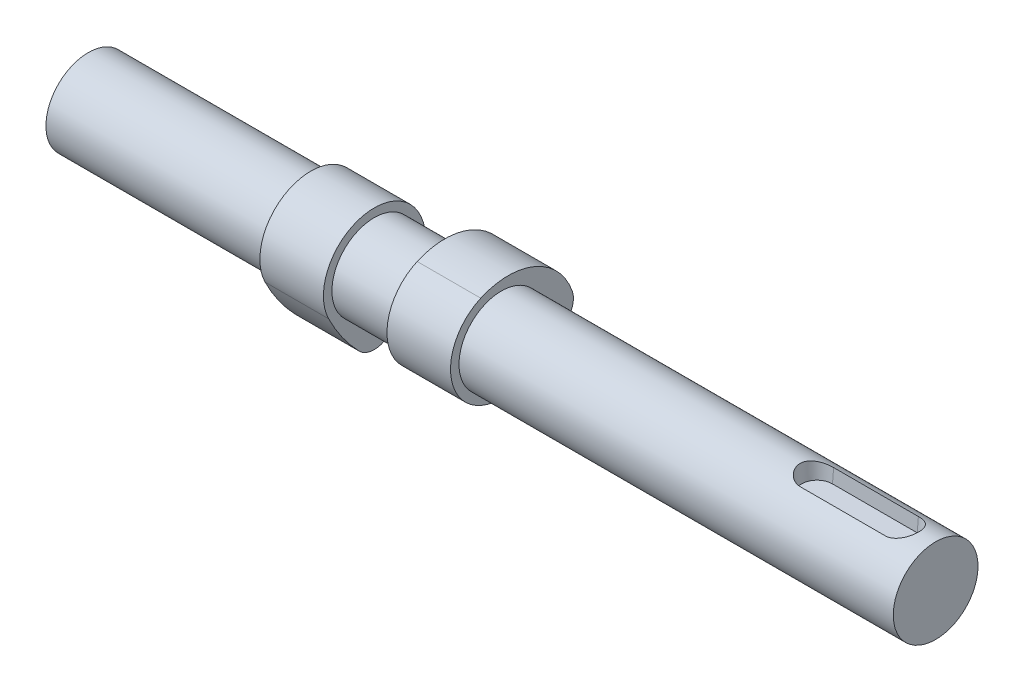
ISO-10303-21;
HEADER;
FILE_DESCRIPTION(('STEP AP214'),'2;1');
FILE_NAME('part.step','',(''),(''),'','','');
FILE_SCHEMA(('AUTOMOTIVE_DESIGN { 1 0 10303 214 1 1 1 1 }'));
ENDSEC;
DATA;
#1=APPLICATION_CONTEXT('core data for automotive mechanical design processes');
#2=APPLICATION_PROTOCOL_DEFINITION('international standard','automotive_design',2000,#1);
#3=PRODUCT_CONTEXT('',#1,'mechanical');
#4=PRODUCT('Part','Part','',(#3));
#5=PRODUCT_RELATED_PRODUCT_CATEGORY('part','',(#4));
#6=PRODUCT_DEFINITION_FORMATION('','',#4);
#7=PRODUCT_DEFINITION_CONTEXT('part definition',#1,'design');
#8=PRODUCT_DEFINITION('design','',#6,#7);
#9=PRODUCT_DEFINITION_SHAPE('','',#8);
#10=(LENGTH_UNIT() NAMED_UNIT(*) SI_UNIT(.MILLI.,.METRE.));
#11=(NAMED_UNIT(*) PLANE_ANGLE_UNIT() SI_UNIT($,.RADIAN.));
#12=(NAMED_UNIT(*) SI_UNIT($,.STERADIAN.) SOLID_ANGLE_UNIT());
#13=UNCERTAINTY_MEASURE_WITH_UNIT(LENGTH_MEASURE(1.E-05),#10,'distance_accuracy_value','');
#14=(GEOMETRIC_REPRESENTATION_CONTEXT(3) GLOBAL_UNCERTAINTY_ASSIGNED_CONTEXT((#13)) GLOBAL_UNIT_ASSIGNED_CONTEXT((#10,
#11,#12)) REPRESENTATION_CONTEXT('',''));
#15=CARTESIAN_POINT('',(0.,0.,0.));
#16=DIRECTION('',(0.,0.,1.));
#17=DIRECTION('',(1.,0.,0.));
#18=AXIS2_PLACEMENT_3D('',#15,#16,#17);
#19=CARTESIAN_POINT('',(-22.5,-1.62236318948028,3.65621904177244));
#20=DIRECTION('',(1.,0.,0.));
#21=DIRECTION('',(0.,1.,0.));
#22=AXIS2_PLACEMENT_3D('',#19,#20,#21);
#23=CYLINDRICAL_SURFACE('',#22,16.);
#24=CARTESIAN_POINT('',(-7.5,-1.62236318948028,3.65621904177244));
#25=DIRECTION('',(1.,0.,0.));
#26=DIRECTION('',(0.,1.,0.));
#27=AXIS2_PLACEMENT_3D('',#24,#25,#26);
#28=CIRCLE('',#27,16.);
#29=CARTESIAN_POINT('',(-7.5,-16.7126720366766,-1.66191774626038));
#30=VERTEX_POINT('',#29);
#31=CARTESIAN_POINT('',(-7.5,4.86708956844083,-10.9686571253173));
#32=VERTEX_POINT('',#31);
#33=EDGE_CURVE('E116',#30,#32,#28,.T.);
#34=ORIENTED_EDGE('',*,*,#33,.F.);
#35=DIRECTION('',(1.,0.,0.));
#36=VECTOR('',#35,1.);
#37=CARTESIAN_POINT('',(-22.5,-16.7126720366766,-1.66191774626038));
#38=LINE('',#37,#36);
#39=CARTESIAN_POINT('',(-22.5,-16.7126720366766,-1.66191774626038));
#40=VERTEX_POINT('',#39);
#41=EDGE_CURVE('E119',#40,#30,#38,.T.);
#42=ORIENTED_EDGE('',*,*,#41,.F.);
#43=CARTESIAN_POINT('',(-22.5,-1.62236318948028,3.65621904177244));
#44=DIRECTION('',(1.,0.,0.));
#45=DIRECTION('',(0.,1.,0.));
#46=AXIS2_PLACEMENT_3D('',#43,#44,#45);
#47=CIRCLE('',#46,16.);
#48=CARTESIAN_POINT('',(-22.5,4.86708956844083,-10.9686571253173));
#49=VERTEX_POINT('',#48);
#50=EDGE_CURVE('E112',#40,#49,#47,.T.);
#51=ORIENTED_EDGE('',*,*,#50,.T.);
#52=DIRECTION('',(1.,0.,0.));
#53=VECTOR('',#52,1.);
#54=CARTESIAN_POINT('',(-22.5,4.86708956844083,-10.9686571253173));
#55=LINE('',#54,#53);
#56=EDGE_CURVE('E12',#49,#32,#55,.T.);
#57=ORIENTED_EDGE('',*,*,#56,.T.);
#58=EDGE_LOOP('',(#34,#42,#51,#57));
#59=FACE_BOUND('',#58,.T.);
#60=ADVANCED_FACE('F53',(#59),#23,.T.);
#61=CARTESIAN_POINT('',(-22.5,0.,0.));
#62=DIRECTION('',(1.,0.,0.));
#63=DIRECTION('',(0.,1.,0.));
#64=AXIS2_PLACEMENT_3D('',#61,#62,#63);
#65=CYLINDRICAL_SURFACE('',#64,12.);
#66=CARTESIAN_POINT('',(-7.5,0.,0.));
#67=DIRECTION('',(1.,0.,0.));
#68=DIRECTION('',(0.,-1.,0.));
#69=AXIS2_PLACEMENT_3D('',#66,#67,#68);
#70=CIRCLE('',#69,12.);
#71=CARTESIAN_POINT('',(-7.5,-5.306226616829,10.7630831591536));
#72=VERTEX_POINT('',#71);
#73=EDGE_CURVE('E118',#32,#72,#70,.T.);
#74=ORIENTED_EDGE('',*,*,#73,.F.);
#75=ORIENTED_EDGE('',*,*,#56,.F.);
#76=CARTESIAN_POINT('',(-22.5,0.,0.));
#77=DIRECTION('',(1.,0.,0.));
#78=DIRECTION('',(0.,-1.,0.));
#79=AXIS2_PLACEMENT_3D('',#76,#77,#78);
#80=CIRCLE('',#79,12.);
#81=CARTESIAN_POINT('',(-22.5,-5.306226616829,10.7630831591536));
#82=VERTEX_POINT('',#81);
#83=EDGE_CURVE('E92',#49,#82,#80,.T.);
#84=ORIENTED_EDGE('',*,*,#83,.T.);
#85=DIRECTION('',(1.,0.,0.));
#86=VECTOR('',#85,1.);
#87=CARTESIAN_POINT('',(-22.5,-5.306226616829,10.7630831591536));
#88=LINE('',#87,#86);
#89=EDGE_CURVE('E61',#82,#72,#88,.T.);
#90=ORIENTED_EDGE('',*,*,#89,.T.);
#91=EDGE_LOOP('',(#74,#75,#84,#90));
#92=FACE_BOUND('',#91,.T.);
#93=ADVANCED_FACE('F108',(#92),#65,.T.);
#94=CARTESIAN_POINT('',(-22.5,12.3811954392677,-25.1138607046917));
#95=DIRECTION('',(1.,0.,0.));
#96=DIRECTION('',(0.,1.,0.));
#97=AXIS2_PLACEMENT_3D('',#94,#95,#96);
#98=CYLINDRICAL_SURFACE('',#97,40.);
#99=CARTESIAN_POINT('',(-7.5,12.3811954392677,-25.1138607046917));
#100=DIRECTION('',(1.,0.,0.));
#101=DIRECTION('',(0.,-1.,0.));
#102=AXIS2_PLACEMENT_3D('',#99,#100,#101);
#103=CIRCLE('',#102,40.);
#104=CARTESIAN_POINT('',(-7.5,-15.4795428020985,3.58769438638438));
#105=VERTEX_POINT('',#104);
#106=EDGE_CURVE('E104',#72,#105,#103,.T.);
#107=ORIENTED_EDGE('',*,*,#106,.F.);
#108=ORIENTED_EDGE('',*,*,#89,.F.);
#109=CARTESIAN_POINT('',(-22.5,12.3811954392677,-25.1138607046917));
#110=DIRECTION('',(1.,0.,0.));
#111=DIRECTION('',(0.,-1.,0.));
#112=AXIS2_PLACEMENT_3D('',#109,#110,#111);
#113=CIRCLE('',#112,40.);
#114=CARTESIAN_POINT('',(-22.5,-15.4795428020985,3.58769438638438));
#115=VERTEX_POINT('',#114);
#116=EDGE_CURVE('E98',#82,#115,#113,.T.);
#117=ORIENTED_EDGE('',*,*,#116,.T.);
#118=DIRECTION('',(1.,0.,0.));
#119=VECTOR('',#118,1.);
#120=CARTESIAN_POINT('',(-22.5,-15.4795428020985,3.58769438638438));
#121=LINE('',#120,#119);
#122=EDGE_CURVE('E107',#115,#105,#121,.T.);
#123=ORIENTED_EDGE('',*,*,#122,.T.);
#124=EDGE_LOOP('',(#107,#108,#117,#123));
#125=FACE_BOUND('',#124,.T.);
#126=ADVANCED_FACE('F102',(#125),#98,.T.);
#127=CARTESIAN_POINT('',(-22.5,-11.9969505219278,-1.25661386611005E-13));
#128=DIRECTION('',(1.,0.,0.));
#129=DIRECTION('',(0.,1.,0.));
#130=AXIS2_PLACEMENT_3D('',#127,#128,#129);
#131=CYLINDRICAL_SURFACE('',#130,5.);
#132=CARTESIAN_POINT('',(-7.5,-11.9969505219278,-1.25661386611005E-13));
#133=DIRECTION('',(1.,0.,0.));
#134=DIRECTION('',(0.,1.,0.));
#135=AXIS2_PLACEMENT_3D('',#132,#133,#134);
#136=CIRCLE('',#135,5.);
#137=EDGE_CURVE('E82',#105,#30,#136,.T.);
#138=ORIENTED_EDGE('',*,*,#137,.F.);
#139=ORIENTED_EDGE('',*,*,#122,.F.);
#140=CARTESIAN_POINT('',(-22.5,-11.9969505219278,-1.25661386611005E-13));
#141=DIRECTION('',(1.,0.,0.));
#142=DIRECTION('',(0.,1.,0.));
#143=AXIS2_PLACEMENT_3D('',#140,#141,#142);
#144=CIRCLE('',#143,5.);
#145=EDGE_CURVE('E69',#115,#40,#144,.T.);
#146=ORIENTED_EDGE('',*,*,#145,.T.);
#147=ORIENTED_EDGE('',*,*,#41,.T.);
#148=EDGE_LOOP('',(#138,#139,#146,#147));
#149=FACE_BOUND('',#148,.T.);
#150=ADVANCED_FACE('F126',(#149),#131,.T.);
#151=CARTESIAN_POINT('',(-22.5,-6.80965685570402,1.82810952088616));
#152=DIRECTION('',(1.,0.,0.));
#153=DIRECTION('',(0.,1.,0.));
#154=AXIS2_PLACEMENT_3D('',#151,#152,#153);
#155=PLANE('',#154);
#156=ORIENTED_EDGE('',*,*,#50,.F.);
#157=ORIENTED_EDGE('',*,*,#145,.F.);
#158=ORIENTED_EDGE('',*,*,#116,.F.);
#159=ORIENTED_EDGE('',*,*,#83,.F.);
#160=EDGE_LOOP('',(#156,#157,#158,#159));
#161=FACE_BOUND('',#160,.T.);
#162=ADVANCED_FACE('F99',(#161),#155,.F.);
#163=CARTESIAN_POINT('',(-7.5,-6.80965685570402,1.82810952088616));
#164=DIRECTION('',(1.,0.,0.));
#165=DIRECTION('',(0.,1.,0.));
#166=AXIS2_PLACEMENT_3D('',#163,#164,#165);
#167=PLANE('',#166);
#168=ORIENTED_EDGE('',*,*,#33,.T.);
#169=ORIENTED_EDGE('',*,*,#73,.T.);
#170=ORIENTED_EDGE('',*,*,#106,.T.);
#171=ORIENTED_EDGE('',*,*,#137,.T.);
#172=EDGE_LOOP('',(#168,#169,#170,#171));
#173=FACE_BOUND('',#172,.T.);
#174=ADVANCED_FACE('F122',(#173),#167,.T.);
#175=CLOSED_SHELL('',(#60,#93,#126,#150,#162,#174));
#176=MANIFOLD_SOLID_BREP('B2',#175);
#177=CARTESIAN_POINT('',(22.5,-3.65621904177246,-1.62236318948024));
#178=DIRECTION('',(-1.,0.,0.));
#179=DIRECTION('',(0.,0.,1.));
#180=AXIS2_PLACEMENT_3D('',#177,#178,#179);
#181=CYLINDRICAL_SURFACE('',#180,16.);
#182=CARTESIAN_POINT('',(7.5,-3.65621904177246,-1.62236318948024));
#183=DIRECTION('',(1.,0.,0.));
#184=DIRECTION('',(0.,0.,1.));
#185=AXIS2_PLACEMENT_3D('',#182,#183,#184);
#186=CIRCLE('',#185,16.);
#187=CARTESIAN_POINT('',(7.5,1.66191774626021,-16.7126720366766));
#188=VERTEX_POINT('',#187);
#189=CARTESIAN_POINT('',(7.5,10.9686571253174,4.86708956844071));
#190=VERTEX_POINT('',#189);
#191=EDGE_CURVE('E249',#188,#190,#186,.T.);
#192=ORIENTED_EDGE('',*,*,#191,.T.);
#193=DIRECTION('',(-1.,0.,0.));
#194=VECTOR('',#193,1.);
#195=CARTESIAN_POINT('',(22.5,10.9686571253174,4.86708956844071));
#196=LINE('',#195,#194);
#197=CARTESIAN_POINT('',(22.5,10.9686571253174,4.86708956844071));
#198=VERTEX_POINT('',#197);
#199=EDGE_CURVE('E55',#198,#190,#196,.T.);
#200=ORIENTED_EDGE('',*,*,#199,.F.);
#201=CARTESIAN_POINT('',(22.5,-3.65621904177246,-1.62236318948024));
#202=DIRECTION('',(1.,0.,0.));
#203=DIRECTION('',(0.,0.,1.));
#204=AXIS2_PLACEMENT_3D('',#201,#202,#203);
#205=CIRCLE('',#204,16.);
#206=CARTESIAN_POINT('',(22.5,1.66191774626021,-16.7126720366766));
#207=VERTEX_POINT('',#206);
#208=EDGE_CURVE('E236',#207,#198,#205,.T.);
#209=ORIENTED_EDGE('',*,*,#208,.F.);
#210=DIRECTION('',(-1.,0.,0.));
#211=VECTOR('',#210,1.);
#212=CARTESIAN_POINT('',(22.5,1.66191774626021,-16.7126720366766));
#213=LINE('',#212,#211);
#214=EDGE_CURVE('E246',#207,#188,#213,.T.);
#215=ORIENTED_EDGE('',*,*,#214,.T.);
#216=EDGE_LOOP('',(#192,#200,#209,#215));
#217=FACE_BOUND('',#216,.T.);
#218=ADVANCED_FACE('F186',(#217),#181,.T.);
#219=CARTESIAN_POINT('',(22.5,0.,0.));
#220=DIRECTION('',(-1.,0.,0.));
#221=DIRECTION('',(0.,0.,1.));
#222=AXIS2_PLACEMENT_3D('',#219,#220,#221);
#223=CYLINDRICAL_SURFACE('',#222,12.);
#224=CARTESIAN_POINT('',(7.5,0.,0.));
#225=DIRECTION('',(1.,0.,0.));
#226=DIRECTION('',(0.,0.,-1.));
#227=AXIS2_PLACEMENT_3D('',#224,#225,#226);
#228=CIRCLE('',#227,12.);
#229=CARTESIAN_POINT('',(7.5,-10.7630831591536,-5.30622661682889));
#230=VERTEX_POINT('',#229);
#231=EDGE_CURVE('E241',#190,#230,#228,.T.);
#232=ORIENTED_EDGE('',*,*,#231,.T.);
#233=DIRECTION('',(-1.,0.,0.));
#234=VECTOR('',#233,1.);
#235=CARTESIAN_POINT('',(22.5,-10.7630831591536,-5.30622661682889));
#236=LINE('',#235,#234);
#237=CARTESIAN_POINT('',(22.5,-10.7630831591536,-5.30622661682889));
#238=VERTEX_POINT('',#237);
#239=EDGE_CURVE('E194',#238,#230,#236,.T.);
#240=ORIENTED_EDGE('',*,*,#239,.F.);
#241=CARTESIAN_POINT('',(22.5,0.,0.));
#242=DIRECTION('',(1.,0.,0.));
#243=DIRECTION('',(0.,0.,-1.));
#244=AXIS2_PLACEMENT_3D('',#241,#242,#243);
#245=CIRCLE('',#244,12.);
#246=EDGE_CURVE('E233',#198,#238,#245,.T.);
#247=ORIENTED_EDGE('',*,*,#246,.F.);
#248=ORIENTED_EDGE('',*,*,#199,.T.);
#249=EDGE_LOOP('',(#232,#240,#247,#248));
#250=FACE_BOUND('',#249,.T.);
#251=ADVANCED_FACE('F244',(#250),#223,.T.);
#252=CARTESIAN_POINT('',(22.5,25.1138607046918,12.3811954392674));
#253=DIRECTION('',(-1.,0.,0.));
#254=DIRECTION('',(0.,0.,1.));
#255=AXIS2_PLACEMENT_3D('',#252,#253,#254);
#256=CYLINDRICAL_SURFACE('',#255,40.);
#257=CARTESIAN_POINT('',(7.5,25.1138607046918,12.3811954392674));
#258=DIRECTION('',(1.,0.,0.));
#259=DIRECTION('',(0.,0.,-1.));
#260=AXIS2_PLACEMENT_3D('',#257,#258,#259);
#261=CIRCLE('',#260,40.);
#262=CARTESIAN_POINT('',(7.5,-3.58769438638454,-15.4795428020985));
#263=VERTEX_POINT('',#262);
#264=EDGE_CURVE('E219',#230,#263,#261,.T.);
#265=ORIENTED_EDGE('',*,*,#264,.T.);
#266=DIRECTION('',(-1.,0.,0.));
#267=VECTOR('',#266,1.);
#268=CARTESIAN_POINT('',(22.5,-3.58769438638454,-15.4795428020985));
#269=LINE('',#268,#267);
#270=CARTESIAN_POINT('',(22.5,-3.58769438638454,-15.4795428020985));
#271=VERTEX_POINT('',#270);
#272=EDGE_CURVE('E245',#271,#263,#269,.T.);
#273=ORIENTED_EDGE('',*,*,#272,.F.);
#274=CARTESIAN_POINT('',(22.5,25.1138607046918,12.3811954392674));
#275=DIRECTION('',(1.,0.,0.));
#276=DIRECTION('',(0.,0.,-1.));
#277=AXIS2_PLACEMENT_3D('',#274,#275,#276);
#278=CIRCLE('',#277,40.);
#279=EDGE_CURVE('E237',#238,#271,#278,.T.);
#280=ORIENTED_EDGE('',*,*,#279,.F.);
#281=ORIENTED_EDGE('',*,*,#239,.T.);
#282=EDGE_LOOP('',(#265,#273,#280,#281));
#283=FACE_BOUND('',#282,.T.);
#284=ADVANCED_FACE('F243',(#283),#256,.T.);
#285=CARTESIAN_POINT('',(22.5,0.,-11.9969505219278));
#286=DIRECTION('',(-1.,0.,0.));
#287=DIRECTION('',(0.,0.,1.));
#288=AXIS2_PLACEMENT_3D('',#285,#286,#287);
#289=CYLINDRICAL_SURFACE('',#288,5.);
#290=CARTESIAN_POINT('',(7.5,0.,-11.9969505219278));
#291=DIRECTION('',(1.,0.,0.));
#292=DIRECTION('',(0.,0.,1.));
#293=AXIS2_PLACEMENT_3D('',#290,#291,#292);
#294=CIRCLE('',#293,5.);
#295=EDGE_CURVE('E229',#263,#188,#294,.T.);
#296=ORIENTED_EDGE('',*,*,#295,.T.);
#297=ORIENTED_EDGE('',*,*,#214,.F.);
#298=CARTESIAN_POINT('',(22.5,0.,-11.9969505219278));
#299=DIRECTION('',(1.,0.,0.));
#300=DIRECTION('',(0.,0.,1.));
#301=AXIS2_PLACEMENT_3D('',#298,#299,#300);
#302=CIRCLE('',#301,5.);
#303=EDGE_CURVE('E201',#271,#207,#302,.T.);
#304=ORIENTED_EDGE('',*,*,#303,.F.);
#305=ORIENTED_EDGE('',*,*,#272,.T.);
#306=EDGE_LOOP('',(#296,#297,#304,#305));
#307=FACE_BOUND('',#306,.T.);
#308=ADVANCED_FACE('F260',(#307),#289,.T.);
#309=CARTESIAN_POINT('',(22.5,-1.82810952088623,-6.809656855704));
#310=DIRECTION('',(-1.,0.,0.));
#311=DIRECTION('',(0.,0.,1.));
#312=AXIS2_PLACEMENT_3D('',#309,#310,#311);
#313=PLANE('',#312);
#314=ORIENTED_EDGE('',*,*,#208,.T.);
#315=ORIENTED_EDGE('',*,*,#246,.T.);
#316=ORIENTED_EDGE('',*,*,#279,.T.);
#317=ORIENTED_EDGE('',*,*,#303,.T.);
#318=EDGE_LOOP('',(#314,#315,#316,#317));
#319=FACE_BOUND('',#318,.T.);
#320=ADVANCED_FACE('F232',(#319),#313,.F.);
#321=CARTESIAN_POINT('',(7.5,-1.82810952088623,-6.809656855704));
#322=DIRECTION('',(-1.,0.,0.));
#323=DIRECTION('',(0.,0.,1.));
#324=AXIS2_PLACEMENT_3D('',#321,#322,#323);
#325=PLANE('',#324);
#326=ORIENTED_EDGE('',*,*,#191,.F.);
#327=ORIENTED_EDGE('',*,*,#295,.F.);
#328=ORIENTED_EDGE('',*,*,#264,.F.);
#329=ORIENTED_EDGE('',*,*,#231,.F.);
#330=EDGE_LOOP('',(#326,#327,#328,#329));
#331=FACE_BOUND('',#330,.T.);
#332=ADVANCED_FACE('F257',(#331),#325,.T.);
#333=CLOSED_SHELL('',(#218,#251,#284,#308,#320,#332));
#334=MANIFOLD_SOLID_BREP('B6',#333);
#335=CARTESIAN_POINT('',(-75.,0.,0.));
#336=DIRECTION('',(1.,0.,0.));
#337=DIRECTION('',(0.,0.,-1.));
#338=AXIS2_PLACEMENT_3D('',#335,#336,#337);
#339=CYLINDRICAL_SURFACE('',#338,10.);
#340=CARTESIAN_POINT('',(116.9998,9.19554732162666,3.92961950520972));
#341=CARTESIAN_POINT('',(117.108432526229,9.19552396461699,3.92963900895938));
#342=CARTESIAN_POINT('',(117.217054442407,9.19739790113637,3.92528821148888));
#343=CARTESIAN_POINT('',(117.433449189068,9.20478322107421,3.90795696349252));
#344=CARTESIAN_POINT('',(117.541222281507,9.21029343390919,3.89497929010512));
#345=CARTESIAN_POINT('',(117.754805249896,9.2247701416995,3.86056266999496));
#346=CARTESIAN_POINT('',(117.860620479704,9.23372503404509,3.83915212174359));
#347=CARTESIAN_POINT('',(118.069896437043,9.25479066145063,3.78808770588497));
#348=CARTESIAN_POINT('',(118.173357048389,9.26690155187349,3.75843343245227));
#349=CARTESIAN_POINT('',(118.478997114603,9.30741193624863,3.65751207972482));
#350=CARTESIAN_POINT('',(118.676801412905,9.34001597020543,3.57422665843843));
#351=CARTESIAN_POINT('',(119.055656727802,9.41272444967853,3.37809141880251));
#352=CARTESIAN_POINT('',(119.236694043575,9.45283494952218,3.26521770641159));
#353=CARTESIAN_POINT('',(119.586163210606,9.53832850590639,3.00660395270599));
#354=CARTESIAN_POINT('',(119.75359745749,9.58387103250205,2.85956460575029));
#355=CARTESIAN_POINT('',(120.06167183687,9.67365894564606,2.53928149200147));
#356=CARTESIAN_POINT('',(120.202307528385,9.71790411617409,2.36603339048636));
#357=CARTESIAN_POINT('',(120.455271105667,9.8011831339666,1.99346714637655));
#358=CARTESIAN_POINT('',(120.566978377658,9.8400954262747,1.79369791629397));
#359=CARTESIAN_POINT('',(120.754126120008,9.90710575454471,1.37616732968246));
#360=CARTESIAN_POINT('',(120.829586514252,9.93520972983523,1.15841593476275));
#361=CARTESIAN_POINT('',(120.937423647946,9.97586398416611,0.725552222129559));
#362=CARTESIAN_POINT('',(120.972183980034,9.98927144663287,0.511115107829934));
#363=CARTESIAN_POINT('',(121.005253036647,10.0020189726074,0.0790606490660715));
#364=CARTESIAN_POINT('',(121.003575139474,10.0013641990691,-0.138555498890742));
#365=CARTESIAN_POINT('',(120.965065772481,9.98653634618632,-0.557134377313778));
#366=CARTESIAN_POINT('',(120.930314495065,9.97316323800987,-0.758322063329798));
#367=CARTESIAN_POINT('',(120.830073130865,9.93541593559446,-1.15177617887117));
#368=CARTESIAN_POINT('',(120.764581003034,9.91104101089147,-1.34404201509667));
#369=CARTESIAN_POINT('',(120.603676754373,9.8530923067776,-1.71848117040826));
#370=CARTESIAN_POINT('',(120.50772071095,9.81935282430629,-1.90039390354835));
#371=CARTESIAN_POINT('',(120.289247885583,9.74606742103519,-2.246210811776));
#372=CARTESIAN_POINT('',(120.166721786218,9.70651946492988,-2.41010863904957));
#373=CARTESIAN_POINT('',(119.888474496445,9.62225347352947,-2.7278550736791));
#374=CARTESIAN_POINT('',(119.730991599461,9.57736844831364,-2.88011561690001));
#375=CARTESIAN_POINT('',(119.39269852426,9.48965886456742,-3.15714116902367));
#376=CARTESIAN_POINT('',(119.211877236817,9.44683530072072,-3.28189300651247));
#377=CARTESIAN_POINT('',(118.922606169477,9.38686542506334,-3.44824964477365));
#378=CARTESIAN_POINT('',(118.820957447824,9.36724202522513,-3.50106618947219));
#379=CARTESIAN_POINT('',(118.613181248028,9.33044058072897,-3.5979946757925));
#380=CARTESIAN_POINT('',(118.507055578203,9.31326156077457,-3.64211009185353));
#381=CARTESIAN_POINT('',(118.291154422689,9.28193522243321,-3.72122180241614));
#382=CARTESIAN_POINT('',(118.181382861742,9.26778475870701,-3.75622756608453));
#383=CARTESIAN_POINT('',(117.958933082548,9.24298582877054,-3.81684131432378));
#384=CARTESIAN_POINT('',(117.846256085105,9.23233591674958,-3.8424531793048));
#385=CARTESIAN_POINT('',(117.611930809076,9.21440060696265,-3.88528372873352));
#386=CARTESIAN_POINT('',(117.490152858103,9.20735840438907,-3.90189924806992));
#387=CARTESIAN_POINT('',(117.245519514609,9.19791466072452,-3.92407823700824));
#388=CARTESIAN_POINT('',(117.122665085282,9.19550932696913,-3.92965073920191));
#389=CARTESIAN_POINT('',(116.9998,9.19554732162666,-3.92961950520971));
#390=B_SPLINE_CURVE_WITH_KNOTS('',3,(#340,#341,#342,#343,#344,#345,#346,#347,#348,#349,#350,
#351,#352,#353,#354,#355,#356,#357,#358,#359,#360,#361,#362,#363,#364,#365,#366,#367,#368,#369,
#370,#371,#372,#373,#374,#375,#376,#377,#378,#379,#380,#381,#382,#383,#384,#385,#386,#387,#388,
#389),.UNSPECIFIED.,.F.,.F.,(4,2,2,2,2,2,2,2,2,2,2,2,2,2,2,2,2,2,2,2,2,2,2,2,4),(0.,
0.325775853756532,0.651446885464914,0.976030440919044,1.3006299779342,1.94872565760355,
2.59734632832017,3.27656669617222,3.9558995248008,4.64878303442882,5.34128524851461,
5.99080148182277,6.64007924914105,7.25104428619564,7.86204989415494,8.48464423808042,
9.10745726360786,9.77538752835235,10.4436369129641,10.7919327546046,11.1400892357431,
11.4878823615824,11.8355316596004,12.2042630896941,12.5726927926964),.UNSPECIFIED.);
#391=CARTESIAN_POINT('',(117.,9.19554731953005,3.92961951011584));
#392=VERTEX_POINT('',#391);
#393=CARTESIAN_POINT('',(117.,9.19554731953009,-3.92961951011584));
#394=VERTEX_POINT('',#393);
#395=EDGE_CURVE('E387',#392,#394,#390,.T.);
#396=ORIENTED_EDGE('',*,*,#395,.F.);
#397=DIRECTION('',(1.,0.,0.));
#398=VECTOR('',#397,1.);
#399=CARTESIAN_POINT('',(-75.,9.19554731953004,3.92961951011594));
#400=LINE('',#399,#398);
#401=CARTESIAN_POINT('',(97.,9.19554731953008,3.92961951011585));
#402=VERTEX_POINT('',#401);
#403=EDGE_CURVE('E183',#402,#392,#400,.T.);
#404=ORIENTED_EDGE('',*,*,#403,.F.);
#405=CARTESIAN_POINT('',(97.0002,9.19554732162666,-3.92961950520972));
#406=CARTESIAN_POINT('',(96.8915674737709,9.19552396461699,-3.92963900895938));
#407=CARTESIAN_POINT('',(96.7829455575925,9.19739790113637,-3.92528821148888));
#408=CARTESIAN_POINT('',(96.5665508109321,9.20478322107421,-3.90795696349253));
#409=CARTESIAN_POINT('',(96.4587777184928,9.21029343390918,-3.89497929010512));
#410=CARTESIAN_POINT('',(96.2451947501037,9.2247701416995,-3.86056266999497));
#411=CARTESIAN_POINT('',(96.1393795202961,9.23372503404509,-3.8391521217436));
#412=CARTESIAN_POINT('',(95.9301035629572,9.25479066145062,-3.78808770588498));
#413=CARTESIAN_POINT('',(95.8266429516112,9.26690155187348,-3.75843343245228));
#414=CARTESIAN_POINT('',(95.5210028853967,9.30741193624863,-3.65751207972483));
#415=CARTESIAN_POINT('',(95.3231985870946,9.34001597020543,-3.57422665843844));
#416=CARTESIAN_POINT('',(94.9443432721979,9.41272444967853,-3.37809141880252));
#417=CARTESIAN_POINT('',(94.7633059564248,9.45283494952218,-3.2652177064116));
#418=CARTESIAN_POINT('',(94.413836789394,9.53832850590638,-3.00660395270601));
#419=CARTESIAN_POINT('',(94.2464025425101,9.58387103250204,-2.85956460575031));
#420=CARTESIAN_POINT('',(93.9383281631304,9.67365894564605,-2.53928149200149));
#421=CARTESIAN_POINT('',(93.7976924716152,9.71790411617409,-2.36603339048638));
#422=CARTESIAN_POINT('',(93.544728894333,9.8011831339666,-1.99346714637657));
#423=CARTESIAN_POINT('',(93.4330216223424,9.8400954262747,-1.793697916294));
#424=CARTESIAN_POINT('',(93.2458738799919,9.90710575454471,-1.37616732968248));
#425=CARTESIAN_POINT('',(93.1704134857481,9.93520972983523,-1.15841593476277));
#426=CARTESIAN_POINT('',(93.0625763520545,9.97586398416611,-0.725552222129581));
#427=CARTESIAN_POINT('',(93.0278160199655,9.98927144663287,-0.511115107829955));
#428=CARTESIAN_POINT('',(92.9947469633532,10.0020189726074,-0.0790606490660888));
#429=CARTESIAN_POINT('',(92.9964248605263,10.0013641990691,0.138555498890726));
#430=CARTESIAN_POINT('',(93.0349342275193,9.98653634618633,0.557134377313764));
#431=CARTESIAN_POINT('',(93.0696855049346,9.97316323800987,0.758322063329785));
#432=CARTESIAN_POINT('',(93.1699268691349,9.93541593559446,1.15177617887115));
#433=CARTESIAN_POINT('',(93.2354189969656,9.91104101089147,1.34404201509665));
#434=CARTESIAN_POINT('',(93.3963232456273,9.85309230677761,1.71848117040825));
#435=CARTESIAN_POINT('',(93.4922792890503,9.81935282430629,1.90039390354834));
#436=CARTESIAN_POINT('',(93.7107521144166,9.74606742103519,2.24621081177599));
#437=CARTESIAN_POINT('',(93.8332782137822,9.70651946492988,2.41010863904956));
#438=CARTESIAN_POINT('',(94.1115255035547,9.62225347352947,2.72785507367909));
#439=CARTESIAN_POINT('',(94.2690084005388,9.57736844831364,2.88011561690001));
#440=CARTESIAN_POINT('',(94.6073014757403,9.48965886456742,3.15714116902367));
#441=CARTESIAN_POINT('',(94.7881227631832,9.44683530072072,3.28189300651246));
#442=CARTESIAN_POINT('',(95.0773938305227,9.38686542506334,3.44824964477365));
#443=CARTESIAN_POINT('',(95.1790425521757,9.36724202522513,3.50106618947219));
#444=CARTESIAN_POINT('',(95.386818751972,9.33044058072897,3.5979946757925));
#445=CARTESIAN_POINT('',(95.4929444217969,9.31326156077457,3.64211009185353));
#446=CARTESIAN_POINT('',(95.7088455773114,9.28193522243321,3.72122180241614));
#447=CARTESIAN_POINT('',(95.8186171382581,9.26778475870701,3.75622756608453));
#448=CARTESIAN_POINT('',(96.0410669174522,9.24298582877054,3.81684131432378));
#449=CARTESIAN_POINT('',(96.1537439148954,9.23233591674958,3.84245317930481));
#450=CARTESIAN_POINT('',(96.388069190924,9.21440060696265,3.88528372873353));
#451=CARTESIAN_POINT('',(96.5098471418972,9.20735840438907,3.90189924806993));
#452=CARTESIAN_POINT('',(96.7544804853914,9.19791466072452,3.92407823700825));
#453=CARTESIAN_POINT('',(96.8773349147178,9.19550932696913,3.92965073920192));
#454=CARTESIAN_POINT('',(97.0002,9.19554732162666,3.92961950520973));
#455=B_SPLINE_CURVE_WITH_KNOTS('',3,(#405,#406,#407,#408,#409,#410,#411,#412,#413,#414,#415,
#416,#417,#418,#419,#420,#421,#422,#423,#424,#425,#426,#427,#428,#429,#430,#431,#432,#433,#434,
#435,#436,#437,#438,#439,#440,#441,#442,#443,#444,#445,#446,#447,#448,#449,#450,#451,#452,#453,
#454),.UNSPECIFIED.,.F.,.F.,(4,2,2,2,2,2,2,2,2,2,2,2,2,2,2,2,2,2,2,2,2,2,2,2,4),(0.,
0.325775853756532,0.6514468854649,0.976030440919029,1.30062997793418,1.94872565760355,
2.59734632832015,3.2765666961722,3.95589952480077,4.6487830344288,5.34128524851459,
5.99080148182276,6.64007924914104,7.25104428619563,7.86204989415493,8.48464423808041,
9.10745726360786,9.77538752835234,10.443636912964,10.7919327546046,11.1400892357431,
11.4878823615824,11.8355316596004,12.2042630896941,12.5726927926964),.UNSPECIFIED.);
#456=CARTESIAN_POINT('',(97.,9.19554731953007,-3.92961951011584));
#457=VERTEX_POINT('',#456);
#458=EDGE_CURVE('E317',#457,#402,#455,.T.);
#459=ORIENTED_EDGE('',*,*,#458,.F.);
#460=DIRECTION('',(1.,0.,0.));
#461=VECTOR('',#460,1.);
#462=CARTESIAN_POINT('',(-75.,9.19554731953007,-3.92961951011587));
#463=LINE('',#462,#461);
#464=EDGE_CURVE('E358',#394,#457,#463,.F.);
#465=ORIENTED_EDGE('',*,*,#464,.F.);
#466=EDGE_LOOP('',(#396,#404,#459,#465));
#467=FACE_BOUND('',#466,.T.);
#468=CARTESIAN_POINT('',(-75.,0.,0.));
#469=DIRECTION('',(1.,0.,0.));
#470=DIRECTION('',(0.,0.,-1.));
#471=AXIS2_PLACEMENT_3D('',#468,#469,#470);
#472=CIRCLE('',#471,10.);
#473=CARTESIAN_POINT('',(-75.,0.,-10.));
#474=VERTEX_POINT('',#473);
#475=EDGE_CURVE('E382',#474,#474,#472,.T.);
#476=ORIENTED_EDGE('',*,*,#475,.T.);
#477=EDGE_LOOP('',(#476));
#478=FACE_BOUND('',#477,.T.);
#479=CARTESIAN_POINT('',(125.,0.,0.));
#480=DIRECTION('',(1.,0.,0.));
#481=DIRECTION('',(0.,0.,-1.));
#482=AXIS2_PLACEMENT_3D('',#479,#480,#481);
#483=CIRCLE('',#482,10.);
#484=CARTESIAN_POINT('',(125.,0.,-10.));
#485=VERTEX_POINT('',#484);
#486=EDGE_CURVE('E359',#485,#485,#483,.T.);
#487=ORIENTED_EDGE('',*,*,#486,.F.);
#488=EDGE_LOOP('',(#487));
#489=FACE_BOUND('',#488,.T.);
#490=ADVANCED_FACE('F313',(#467,#478,#489),#339,.T.);
#491=CARTESIAN_POINT('',(-75.,0.,0.));
#492=DIRECTION('',(1.,0.,0.));
#493=DIRECTION('',(0.,0.,-1.));
#494=AXIS2_PLACEMENT_3D('',#491,#492,#493);
#495=PLANE('',#494);
#496=ORIENTED_EDGE('',*,*,#475,.F.);
#497=EDGE_LOOP('',(#496));
#498=FACE_BOUND('',#497,.T.);
#499=ADVANCED_FACE('F403',(#498),#495,.F.);
#500=CARTESIAN_POINT('',(125.,0.,0.));
#501=DIRECTION('',(1.,0.,0.));
#502=DIRECTION('',(0.,0.,-1.));
#503=AXIS2_PLACEMENT_3D('',#500,#501,#502);
#504=PLANE('',#503);
#505=ORIENTED_EDGE('',*,*,#486,.T.);
#506=EDGE_LOOP('',(#505));
#507=FACE_BOUND('',#506,.T.);
#508=ADVANCED_FACE('F401',(#507),#504,.T.);
#509=CARTESIAN_POINT('',(97.,10.,0.));
#510=DIRECTION('',(0.,1.,0.));
#511=DIRECTION('',(0.,0.,1.));
#512=AXIS2_PLACEMENT_3D('',#509,#510,#511);
#513=CONICAL_SURFACE('',#512,4.00000000000001,0.0872664625997167);
#514=DIRECTION('',(0.,0.996194698091745,-0.0871557427476584));
#515=VECTOR('',#514,1.);
#516=CARTESIAN_POINT('',(97.,10.,-4.));
#517=LINE('',#516,#515);
#518=CARTESIAN_POINT('',(97.,6.,-3.65004534589631));
#519=VERTEX_POINT('',#518);
#520=EDGE_CURVE('E351',#519,#457,#517,.T.);
#521=ORIENTED_EDGE('',*,*,#520,.T.);
#522=ORIENTED_EDGE('',*,*,#458,.T.);
#523=DIRECTION('',(0.,0.996194698091745,0.0871557427476584));
#524=VECTOR('',#523,1.);
#525=CARTESIAN_POINT('',(97.,10.,4.00000000000001));
#526=LINE('',#525,#524);
#527=CARTESIAN_POINT('',(97.,6.,3.65004534589631));
#528=VERTEX_POINT('',#527);
#529=EDGE_CURVE('E324',#528,#402,#526,.T.);
#530=ORIENTED_EDGE('',*,*,#529,.F.);
#531=CARTESIAN_POINT('',(97.,6.,0.));
#532=DIRECTION('',(0.,1.,0.));
#533=DIRECTION('',(0.,0.,1.));
#534=AXIS2_PLACEMENT_3D('',#531,#532,#533);
#535=CIRCLE('',#534,3.65004534589631);
#536=EDGE_CURVE('E365',#519,#528,#535,.T.);
#537=ORIENTED_EDGE('',*,*,#536,.F.);
#538=EDGE_LOOP('',(#521,#522,#530,#537));
#539=FACE_BOUND('',#538,.T.);
#540=ADVANCED_FACE('F364',(#539),#513,.F.);
#541=CARTESIAN_POINT('',(97.,10.,-4.));
#542=DIRECTION('',(0.,-0.0871557427476584,-0.996194698091746));
#543=DIRECTION('',(0.,-0.996194698091746,0.0871557427476584));
#544=AXIS2_PLACEMENT_3D('',#541,#542,#543);
#545=PLANE('',#544);
#546=ORIENTED_EDGE('',*,*,#464,.T.);
#547=ORIENTED_EDGE('',*,*,#520,.F.);
#548=DIRECTION('',(-1.,0.,0.));
#549=VECTOR('',#548,1.);
#550=CARTESIAN_POINT('',(97.,6.,-3.65004534589631));
#551=LINE('',#550,#549);
#552=CARTESIAN_POINT('',(117.,6.,-3.6500453458963));
#553=VERTEX_POINT('',#552);
#554=EDGE_CURVE('E360',#553,#519,#551,.T.);
#555=ORIENTED_EDGE('',*,*,#554,.F.);
#556=DIRECTION('',(0.,0.996194698091745,-0.0871557427476584));
#557=VECTOR('',#556,1.);
#558=CARTESIAN_POINT('',(117.,10.,-4.));
#559=LINE('',#558,#557);
#560=EDGE_CURVE('E363',#553,#394,#559,.T.);
#561=ORIENTED_EDGE('',*,*,#560,.T.);
#562=EDGE_LOOP('',(#546,#547,#555,#561));
#563=FACE_BOUND('',#562,.T.);
#564=ADVANCED_FACE('F353',(#563),#545,.F.);
#565=CARTESIAN_POINT('',(117.,10.,0.));
#566=DIRECTION('',(0.,1.,0.));
#567=DIRECTION('',(0.,0.,1.));
#568=AXIS2_PLACEMENT_3D('',#565,#566,#567);
#569=CONICAL_SURFACE('',#568,4.,0.0872664625997167);
#570=DIRECTION('',(0.,0.996194698091745,0.0871557427476584));
#571=VECTOR('',#570,1.);
#572=CARTESIAN_POINT('',(117.,10.,4.));
#573=LINE('',#572,#571);
#574=CARTESIAN_POINT('',(117.,6.,3.6500453458963));
#575=VERTEX_POINT('',#574);
#576=EDGE_CURVE('E374',#575,#392,#573,.T.);
#577=ORIENTED_EDGE('',*,*,#576,.T.);
#578=ORIENTED_EDGE('',*,*,#395,.T.);
#579=ORIENTED_EDGE('',*,*,#560,.F.);
#580=CARTESIAN_POINT('',(117.,6.,0.));
#581=DIRECTION('',(0.,1.,0.));
#582=DIRECTION('',(0.,0.,1.));
#583=AXIS2_PLACEMENT_3D('',#580,#581,#582);
#584=CIRCLE('',#583,3.6500453458963);
#585=EDGE_CURVE('E373',#575,#553,#584,.T.);
#586=ORIENTED_EDGE('',*,*,#585,.F.);
#587=EDGE_LOOP('',(#577,#578,#579,#586));
#588=FACE_BOUND('',#587,.T.);
#589=ADVANCED_FACE('F395',(#588),#569,.F.);
#590=CARTESIAN_POINT('',(97.,10.,4.00000000000001));
#591=DIRECTION('',(0.,-0.0871557427476584,0.996194698091746));
#592=DIRECTION('',(0.,-0.996194698091746,-0.0871557427476584));
#593=AXIS2_PLACEMENT_3D('',#590,#591,#592);
#594=PLANE('',#593);
#595=ORIENTED_EDGE('',*,*,#403,.T.);
#596=ORIENTED_EDGE('',*,*,#576,.F.);
#597=DIRECTION('',(1.,0.,0.));
#598=VECTOR('',#597,1.);
#599=CARTESIAN_POINT('',(97.,6.,3.65004534589631));
#600=LINE('',#599,#598);
#601=EDGE_CURVE('E366',#528,#575,#600,.T.);
#602=ORIENTED_EDGE('',*,*,#601,.F.);
#603=ORIENTED_EDGE('',*,*,#529,.T.);
#604=EDGE_LOOP('',(#595,#596,#602,#603));
#605=FACE_BOUND('',#604,.T.);
#606=ADVANCED_FACE('F398',(#605),#594,.F.);
#607=CARTESIAN_POINT('',(97.,6.,0.));
#608=DIRECTION('',(0.,1.,0.));
#609=DIRECTION('',(0.,0.,1.));
#610=AXIS2_PLACEMENT_3D('',#607,#608,#609);
#611=PLANE('',#610);
#612=ORIENTED_EDGE('',*,*,#536,.T.);
#613=ORIENTED_EDGE('',*,*,#601,.T.);
#614=ORIENTED_EDGE('',*,*,#585,.T.);
#615=ORIENTED_EDGE('',*,*,#554,.T.);
#616=EDGE_LOOP('',(#612,#613,#614,#615));
#617=FACE_BOUND('',#616,.T.);
#618=ADVANCED_FACE('F371',(#617),#611,.T.);
#619=CLOSED_SHELL('',(#490,#499,#508,#540,#564,#589,#606,#618));
#620=MANIFOLD_SOLID_BREP('B46',#619);
#621=ADVANCED_BREP_SHAPE_REPRESENTATION('',(#18,#176,#334,#620),#14);
#622=SHAPE_DEFINITION_REPRESENTATION(#9,#621);
ENDSEC;
END-ISO-10303-21;
